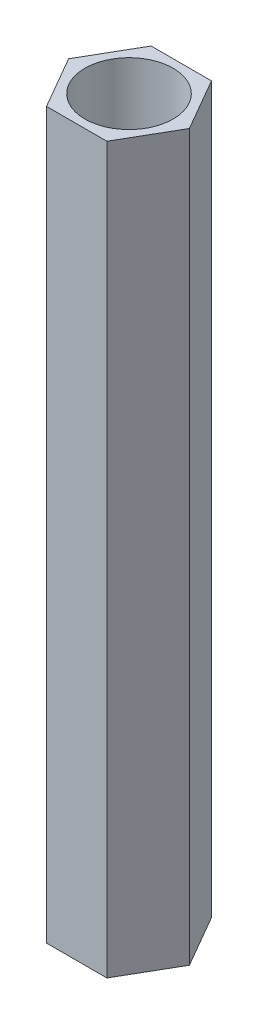
ISO-10303-21;
HEADER;
FILE_DESCRIPTION(('STEP AP214'),'2;1');
FILE_NAME('part.step','',(''),(''),'','','');
FILE_SCHEMA(('AUTOMOTIVE_DESIGN { 1 0 10303 214 1 1 1 1 }'));
ENDSEC;
DATA;
#1=APPLICATION_CONTEXT('core data for automotive mechanical design processes');
#2=APPLICATION_PROTOCOL_DEFINITION('international standard','automotive_design',2000,#1);
#3=PRODUCT_CONTEXT('',#1,'mechanical');
#4=PRODUCT('Part','Part','',(#3));
#5=PRODUCT_RELATED_PRODUCT_CATEGORY('part','',(#4));
#6=PRODUCT_DEFINITION_FORMATION('','',#4);
#7=PRODUCT_DEFINITION_CONTEXT('part definition',#1,'design');
#8=PRODUCT_DEFINITION('design','',#6,#7);
#9=PRODUCT_DEFINITION_SHAPE('','',#8);
#10=(LENGTH_UNIT() NAMED_UNIT(*) SI_UNIT(.MILLI.,.METRE.));
#11=(NAMED_UNIT(*) PLANE_ANGLE_UNIT() SI_UNIT($,.RADIAN.));
#12=(NAMED_UNIT(*) SI_UNIT($,.STERADIAN.) SOLID_ANGLE_UNIT());
#13=UNCERTAINTY_MEASURE_WITH_UNIT(LENGTH_MEASURE(1.E-05),#10,'distance_accuracy_value','');
#14=(GEOMETRIC_REPRESENTATION_CONTEXT(3) GLOBAL_UNCERTAINTY_ASSIGNED_CONTEXT((#13)) GLOBAL_UNIT_ASSIGNED_CONTEXT((#10,
#11,#12)) REPRESENTATION_CONTEXT('',''));
#15=CARTESIAN_POINT('',(0.,0.,0.));
#16=DIRECTION('',(0.,0.,1.));
#17=DIRECTION('',(1.,0.,0.));
#18=AXIS2_PLACEMENT_3D('',#15,#16,#17);
#19=CARTESIAN_POINT('',(0.,30.,0.));
#20=DIRECTION('',(0.,1.,0.));
#21=DIRECTION('',(0.,0.,1.));
#22=AXIS2_PLACEMENT_3D('',#19,#20,#21);
#23=PLANE('',#22);
#24=DIRECTION('',(0.5,0.,-0.866025403784439));
#25=VECTOR('',#24,1.);
#26=CARTESIAN_POINT('',(1.25,30.,2.1650635094611));
#27=LINE('',#26,#25);
#28=CARTESIAN_POINT('',(1.25,30.,2.1650635094611));
#29=VERTEX_POINT('',#28);
#30=CARTESIAN_POINT('',(2.5,30.,0.));
#31=VERTEX_POINT('',#30);
#32=EDGE_CURVE('E152',#29,#31,#27,.T.);
#33=ORIENTED_EDGE('',*,*,#32,.T.);
#34=DIRECTION('',(-0.5,0.,-0.866025403784439));
#35=VECTOR('',#34,1.);
#36=CARTESIAN_POINT('',(2.5,30.,0.));
#37=LINE('',#36,#35);
#38=CARTESIAN_POINT('',(1.25,30.,-2.1650635094611));
#39=VERTEX_POINT('',#38);
#40=EDGE_CURVE('E100',#31,#39,#37,.T.);
#41=ORIENTED_EDGE('',*,*,#40,.T.);
#42=DIRECTION('',(-1.,0.,0.));
#43=VECTOR('',#42,1.);
#44=CARTESIAN_POINT('',(1.25,30.,-2.1650635094611));
#45=LINE('',#44,#43);
#46=CARTESIAN_POINT('',(-1.25,30.,-2.1650635094611));
#47=VERTEX_POINT('',#46);
#48=EDGE_CURVE('E113',#39,#47,#45,.T.);
#49=ORIENTED_EDGE('',*,*,#48,.T.);
#50=DIRECTION('',(-0.5,0.,0.866025403784439));
#51=VECTOR('',#50,1.);
#52=CARTESIAN_POINT('',(-1.25,30.,-2.1650635094611));
#53=LINE('',#52,#51);
#54=CARTESIAN_POINT('',(-2.5,30.,0.));
#55=VERTEX_POINT('',#54);
#56=EDGE_CURVE('E107',#47,#55,#53,.T.);
#57=ORIENTED_EDGE('',*,*,#56,.T.);
#58=DIRECTION('',(0.5,0.,0.866025403784439));
#59=VECTOR('',#58,1.);
#60=CARTESIAN_POINT('',(-2.5,30.,0.));
#61=LINE('',#60,#59);
#62=CARTESIAN_POINT('',(-1.25,30.,2.1650635094611));
#63=VERTEX_POINT('',#62);
#64=EDGE_CURVE('E111',#55,#63,#61,.T.);
#65=ORIENTED_EDGE('',*,*,#64,.T.);
#66=DIRECTION('',(1.,0.,0.));
#67=VECTOR('',#66,1.);
#68=CARTESIAN_POINT('',(-1.25,30.,2.1650635094611));
#69=LINE('',#68,#67);
#70=EDGE_CURVE('E63',#63,#29,#69,.T.);
#71=ORIENTED_EDGE('',*,*,#70,.T.);
#72=EDGE_LOOP('',(#33,#41,#49,#57,#65,#71));
#73=FACE_BOUND('',#72,.T.);
#74=CARTESIAN_POINT('',(0.,30.,0.));
#75=DIRECTION('',(0.,1.,0.));
#76=DIRECTION('',(0.,0.,1.));
#77=AXIS2_PLACEMENT_3D('',#74,#75,#76);
#78=CIRCLE('',#77,1.825);
#79=CARTESIAN_POINT('',(0.,30.,1.825));
#80=VERTEX_POINT('',#79);
#81=EDGE_CURVE('E140',#80,#80,#78,.T.);
#82=ORIENTED_EDGE('',*,*,#81,.F.);
#83=EDGE_LOOP('',(#82));
#84=FACE_BOUND('',#83,.T.);
#85=ADVANCED_FACE('F45',(#73,#84),#23,.T.);
#86=CARTESIAN_POINT('',(0.,0.,0.));
#87=DIRECTION('',(0.,1.,0.));
#88=DIRECTION('',(0.,0.,1.));
#89=AXIS2_PLACEMENT_3D('',#86,#87,#88);
#90=PLANE('',#89);
#91=DIRECTION('',(0.5,0.,-0.866025403784439));
#92=VECTOR('',#91,1.);
#93=CARTESIAN_POINT('',(1.25,0.,2.1650635094611));
#94=LINE('',#93,#92);
#95=CARTESIAN_POINT('',(1.25,0.,2.1650635094611));
#96=VERTEX_POINT('',#95);
#97=CARTESIAN_POINT('',(2.5,0.,0.));
#98=VERTEX_POINT('',#97);
#99=EDGE_CURVE('E135',#96,#98,#94,.T.);
#100=ORIENTED_EDGE('',*,*,#99,.F.);
#101=DIRECTION('',(1.,0.,0.));
#102=VECTOR('',#101,1.);
#103=CARTESIAN_POINT('',(-1.25,0.,2.1650635094611));
#104=LINE('',#103,#102);
#105=CARTESIAN_POINT('',(-1.25,0.,2.1650635094611));
#106=VERTEX_POINT('',#105);
#107=EDGE_CURVE('E92',#106,#96,#104,.T.);
#108=ORIENTED_EDGE('',*,*,#107,.F.);
#109=DIRECTION('',(0.5,0.,0.866025403784439));
#110=VECTOR('',#109,1.);
#111=CARTESIAN_POINT('',(-2.5,0.,0.));
#112=LINE('',#111,#110);
#113=CARTESIAN_POINT('',(-2.5,0.,0.));
#114=VERTEX_POINT('',#113);
#115=EDGE_CURVE('E86',#114,#106,#112,.T.);
#116=ORIENTED_EDGE('',*,*,#115,.F.);
#117=DIRECTION('',(-0.5,0.,0.866025403784439));
#118=VECTOR('',#117,1.);
#119=CARTESIAN_POINT('',(-1.25,0.,-2.1650635094611));
#120=LINE('',#119,#118);
#121=CARTESIAN_POINT('',(-1.25,0.,-2.1650635094611));
#122=VERTEX_POINT('',#121);
#123=EDGE_CURVE('E122',#122,#114,#120,.T.);
#124=ORIENTED_EDGE('',*,*,#123,.F.);
#125=DIRECTION('',(-1.,0.,0.));
#126=VECTOR('',#125,1.);
#127=CARTESIAN_POINT('',(1.25,0.,-2.1650635094611));
#128=LINE('',#127,#126);
#129=CARTESIAN_POINT('',(1.25,0.,-2.1650635094611));
#130=VERTEX_POINT('',#129);
#131=EDGE_CURVE('E143',#130,#122,#128,.T.);
#132=ORIENTED_EDGE('',*,*,#131,.F.);
#133=DIRECTION('',(-0.5,0.,-0.866025403784439));
#134=VECTOR('',#133,1.);
#135=CARTESIAN_POINT('',(2.5,0.,0.));
#136=LINE('',#135,#134);
#137=EDGE_CURVE('E139',#98,#130,#136,.T.);
#138=ORIENTED_EDGE('',*,*,#137,.F.);
#139=EDGE_LOOP('',(#100,#108,#116,#124,#132,#138));
#140=FACE_BOUND('',#139,.T.);
#141=CARTESIAN_POINT('',(0.,0.,0.));
#142=DIRECTION('',(0.,1.,0.));
#143=DIRECTION('',(0.,0.,1.));
#144=AXIS2_PLACEMENT_3D('',#141,#142,#143);
#145=CIRCLE('',#144,1.825);
#146=CARTESIAN_POINT('',(0.,0.,1.825));
#147=VERTEX_POINT('',#146);
#148=EDGE_CURVE('E249',#147,#147,#145,.T.);
#149=ORIENTED_EDGE('',*,*,#148,.T.);
#150=EDGE_LOOP('',(#149));
#151=FACE_BOUND('',#150,.T.);
#152=ADVANCED_FACE('F165',(#140,#151),#90,.F.);
#153=CARTESIAN_POINT('',(1.25,30.,2.1650635094611));
#154=DIRECTION('',(-0.866025403784439,0.,-0.5));
#155=DIRECTION('',(-0.5,0.,0.866025403784439));
#156=AXIS2_PLACEMENT_3D('',#153,#154,#155);
#157=PLANE('',#156);
#158=ORIENTED_EDGE('',*,*,#99,.T.);
#159=DIRECTION('',(0.,-1.,0.));
#160=VECTOR('',#159,1.);
#161=CARTESIAN_POINT('',(2.5,30.,0.));
#162=LINE('',#161,#160);
#163=EDGE_CURVE('E11',#31,#98,#162,.T.);
#164=ORIENTED_EDGE('',*,*,#163,.F.);
#165=ORIENTED_EDGE('',*,*,#32,.F.);
#166=DIRECTION('',(0.,-1.,0.));
#167=VECTOR('',#166,1.);
#168=CARTESIAN_POINT('',(1.25,30.,2.1650635094611));
#169=LINE('',#168,#167);
#170=EDGE_CURVE('E131',#29,#96,#169,.T.);
#171=ORIENTED_EDGE('',*,*,#170,.T.);
#172=EDGE_LOOP('',(#158,#164,#165,#171));
#173=FACE_BOUND('',#172,.T.);
#174=ADVANCED_FACE('F47',(#173),#157,.F.);
#175=CARTESIAN_POINT('',(2.5,30.,0.));
#176=DIRECTION('',(-0.866025403784439,0.,0.5));
#177=DIRECTION('',(0.5,0.,0.866025403784439));
#178=AXIS2_PLACEMENT_3D('',#175,#176,#177);
#179=PLANE('',#178);
#180=ORIENTED_EDGE('',*,*,#137,.T.);
#181=DIRECTION('',(0.,-1.,0.));
#182=VECTOR('',#181,1.);
#183=CARTESIAN_POINT('',(1.25,30.,-2.1650635094611));
#184=LINE('',#183,#182);
#185=EDGE_CURVE('E55',#39,#130,#184,.T.);
#186=ORIENTED_EDGE('',*,*,#185,.F.);
#187=ORIENTED_EDGE('',*,*,#40,.F.);
#188=ORIENTED_EDGE('',*,*,#163,.T.);
#189=EDGE_LOOP('',(#180,#186,#187,#188));
#190=FACE_BOUND('',#189,.T.);
#191=ADVANCED_FACE('F190',(#190),#179,.F.);
#192=CARTESIAN_POINT('',(1.25,30.,-2.1650635094611));
#193=DIRECTION('',(0.,0.,1.));
#194=DIRECTION('',(1.,0.,0.));
#195=AXIS2_PLACEMENT_3D('',#192,#193,#194);
#196=PLANE('',#195);
#197=ORIENTED_EDGE('',*,*,#131,.T.);
#198=DIRECTION('',(0.,-1.,0.));
#199=VECTOR('',#198,1.);
#200=CARTESIAN_POINT('',(-1.25,30.,-2.1650635094611));
#201=LINE('',#200,#199);
#202=EDGE_CURVE('E124',#47,#122,#201,.T.);
#203=ORIENTED_EDGE('',*,*,#202,.F.);
#204=ORIENTED_EDGE('',*,*,#48,.F.);
#205=ORIENTED_EDGE('',*,*,#185,.T.);
#206=EDGE_LOOP('',(#197,#203,#204,#205));
#207=FACE_BOUND('',#206,.T.);
#208=ADVANCED_FACE('F162',(#207),#196,.F.);
#209=CARTESIAN_POINT('',(-1.25,30.,-2.1650635094611));
#210=DIRECTION('',(0.866025403784439,0.,0.5));
#211=DIRECTION('',(0.5,0.,-0.866025403784439));
#212=AXIS2_PLACEMENT_3D('',#209,#210,#211);
#213=PLANE('',#212);
#214=ORIENTED_EDGE('',*,*,#123,.T.);
#215=DIRECTION('',(0.,-1.,0.));
#216=VECTOR('',#215,1.);
#217=CARTESIAN_POINT('',(-2.5,30.,0.));
#218=LINE('',#217,#216);
#219=EDGE_CURVE('E119',#55,#114,#218,.T.);
#220=ORIENTED_EDGE('',*,*,#219,.F.);
#221=ORIENTED_EDGE('',*,*,#56,.F.);
#222=ORIENTED_EDGE('',*,*,#202,.T.);
#223=EDGE_LOOP('',(#214,#220,#221,#222));
#224=FACE_BOUND('',#223,.T.);
#225=ADVANCED_FACE('F120',(#224),#213,.F.);
#226=CARTESIAN_POINT('',(-2.5,30.,0.));
#227=DIRECTION('',(0.866025403784439,0.,-0.5));
#228=DIRECTION('',(-0.5,0.,-0.866025403784439));
#229=AXIS2_PLACEMENT_3D('',#226,#227,#228);
#230=PLANE('',#229);
#231=ORIENTED_EDGE('',*,*,#115,.T.);
#232=DIRECTION('',(0.,-1.,0.));
#233=VECTOR('',#232,1.);
#234=CARTESIAN_POINT('',(-1.25,30.,2.1650635094611));
#235=LINE('',#234,#233);
#236=EDGE_CURVE('E125',#63,#106,#235,.T.);
#237=ORIENTED_EDGE('',*,*,#236,.F.);
#238=ORIENTED_EDGE('',*,*,#64,.F.);
#239=ORIENTED_EDGE('',*,*,#219,.T.);
#240=EDGE_LOOP('',(#231,#237,#238,#239));
#241=FACE_BOUND('',#240,.T.);
#242=ADVANCED_FACE('F127',(#241),#230,.F.);
#243=CARTESIAN_POINT('',(-1.25,30.,2.1650635094611));
#244=DIRECTION('',(0.,0.,-1.));
#245=DIRECTION('',(-1.,0.,0.));
#246=AXIS2_PLACEMENT_3D('',#243,#244,#245);
#247=PLANE('',#246);
#248=ORIENTED_EDGE('',*,*,#107,.T.);
#249=ORIENTED_EDGE('',*,*,#170,.F.);
#250=ORIENTED_EDGE('',*,*,#70,.F.);
#251=ORIENTED_EDGE('',*,*,#236,.T.);
#252=EDGE_LOOP('',(#248,#249,#250,#251));
#253=FACE_BOUND('',#252,.T.);
#254=ADVANCED_FACE('F170',(#253),#247,.F.);
#255=CARTESIAN_POINT('',(0.,30.,0.));
#256=DIRECTION('',(0.,-1.,0.));
#257=DIRECTION('',(0.,0.,-1.));
#258=AXIS2_PLACEMENT_3D('',#255,#256,#257);
#259=CYLINDRICAL_SURFACE('',#258,1.825);
#260=ORIENTED_EDGE('',*,*,#81,.T.);
#261=EDGE_LOOP('',(#260));
#262=FACE_BOUND('',#261,.T.);
#263=ORIENTED_EDGE('',*,*,#148,.F.);
#264=EDGE_LOOP('',(#263));
#265=FACE_BOUND('',#264,.T.);
#266=ADVANCED_FACE('F172',(#262,#265),#259,.F.);
#267=CLOSED_SHELL('',(#85,#152,#174,#191,#208,#225,#242,#254,#266));
#268=MANIFOLD_SOLID_BREP('B2',#267);
#269=ADVANCED_BREP_SHAPE_REPRESENTATION('',(#18,#268),#14);
#270=SHAPE_DEFINITION_REPRESENTATION(#9,#269);
ENDSEC;
END-ISO-10303-21;
